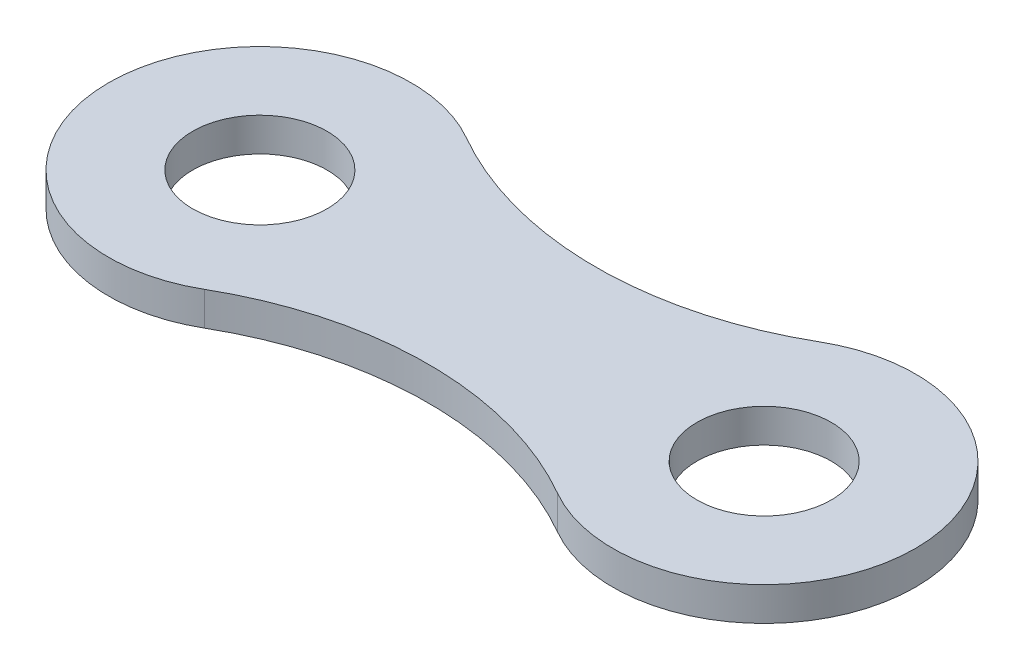
ISO-10303-21;
HEADER;
FILE_DESCRIPTION(('STEP AP214'),'2;1');
FILE_NAME('part.step','',(''),(''),'','','');
FILE_SCHEMA(('AUTOMOTIVE_DESIGN { 1 0 10303 214 1 1 1 1 }'));
ENDSEC;
DATA;
#1=APPLICATION_CONTEXT('core data for automotive mechanical design processes');
#2=APPLICATION_PROTOCOL_DEFINITION('international standard','automotive_design',2000,#1);
#3=PRODUCT_CONTEXT('',#1,'mechanical');
#4=PRODUCT('Part','Part','',(#3));
#5=PRODUCT_RELATED_PRODUCT_CATEGORY('part','',(#4));
#6=PRODUCT_DEFINITION_FORMATION('','',#4);
#7=PRODUCT_DEFINITION_CONTEXT('part definition',#1,'design');
#8=PRODUCT_DEFINITION('design','',#6,#7);
#9=PRODUCT_DEFINITION_SHAPE('','',#8);
#10=(LENGTH_UNIT() NAMED_UNIT(*) SI_UNIT(.MILLI.,.METRE.));
#11=(NAMED_UNIT(*) PLANE_ANGLE_UNIT() SI_UNIT($,.RADIAN.));
#12=(NAMED_UNIT(*) SI_UNIT($,.STERADIAN.) SOLID_ANGLE_UNIT());
#13=UNCERTAINTY_MEASURE_WITH_UNIT(LENGTH_MEASURE(1.E-05),#10,'distance_accuracy_value','');
#14=(GEOMETRIC_REPRESENTATION_CONTEXT(3) GLOBAL_UNCERTAINTY_ASSIGNED_CONTEXT((#13)) GLOBAL_UNIT_ASSIGNED_CONTEXT((#10,
#11,#12)) REPRESENTATION_CONTEXT('',''));
#15=CARTESIAN_POINT('',(0.,0.,0.));
#16=DIRECTION('',(0.,0.,1.));
#17=DIRECTION('',(1.,0.,0.));
#18=AXIS2_PLACEMENT_3D('',#15,#16,#17);
#19=CARTESIAN_POINT('',(-7.5,-1.,0.));
#20=DIRECTION('',(0.,1.,0.));
#21=DIRECTION('',(0.,0.,1.));
#22=AXIS2_PLACEMENT_3D('',#19,#20,#21);
#23=CYLINDRICAL_SURFACE('',#22,4.5);
#24=CARTESIAN_POINT('',(-7.5,0.,0.));
#25=DIRECTION('',(0.,1.,0.));
#26=DIRECTION('',(0.,0.,1.));
#27=AXIS2_PLACEMENT_3D('',#24,#25,#26);
#28=CIRCLE('',#27,4.5);
#29=CARTESIAN_POINT('',(-5.25445833901267,0.,-3.89968494224473));
#30=VERTEX_POINT('',#29);
#31=CARTESIAN_POINT('',(-5.25445833901267,0.,3.89968494224473));
#32=VERTEX_POINT('',#31);
#33=EDGE_CURVE('E104',#30,#32,#28,.T.);
#34=ORIENTED_EDGE('',*,*,#33,.F.);
#35=DIRECTION('',(0.,1.,0.));
#36=VECTOR('',#35,1.);
#37=CARTESIAN_POINT('',(-5.25445833901267,-1.,-3.89968494224473));
#38=LINE('',#37,#36);
#39=CARTESIAN_POINT('',(-5.25445833901267,-1.,-3.89968494224473));
#40=VERTEX_POINT('',#39);
#41=EDGE_CURVE('E11',#40,#30,#38,.T.);
#42=ORIENTED_EDGE('',*,*,#41,.F.);
#43=CARTESIAN_POINT('',(-7.5,-1.,0.));
#44=DIRECTION('',(0.,1.,0.));
#45=DIRECTION('',(0.,0.,1.));
#46=AXIS2_PLACEMENT_3D('',#43,#44,#45);
#47=CIRCLE('',#46,4.5);
#48=CARTESIAN_POINT('',(-5.25445833901267,-1.,3.89968494224473));
#49=VERTEX_POINT('',#48);
#50=EDGE_CURVE('E97',#40,#49,#47,.T.);
#51=ORIENTED_EDGE('',*,*,#50,.T.);
#52=DIRECTION('',(0.,1.,0.));
#53=VECTOR('',#52,1.);
#54=CARTESIAN_POINT('',(-5.25445833901267,-1.,3.89968494224473));
#55=LINE('',#54,#53);
#56=EDGE_CURVE('E42',#49,#32,#55,.T.);
#57=ORIENTED_EDGE('',*,*,#56,.T.);
#58=EDGE_LOOP('',(#34,#42,#51,#57));
#59=FACE_BOUND('',#58,.T.);
#60=ADVANCED_FACE('F39',(#59),#23,.T.);
#61=CARTESIAN_POINT('',(0.,-1.,-13.0247581574486));
#62=DIRECTION('',(0.,1.,0.));
#63=DIRECTION('',(0.,0.,1.));
#64=AXIS2_PLACEMENT_3D('',#61,#62,#63);
#65=CYLINDRICAL_SURFACE('',#64,10.529781271197);
#66=CARTESIAN_POINT('',(0.,0.,-13.0247581574486));
#67=DIRECTION('',(0.,-1.,0.));
#68=DIRECTION('',(0.,0.,1.));
#69=AXIS2_PLACEMENT_3D('',#66,#67,#68);
#70=CIRCLE('',#69,10.529781271197);
#71=CARTESIAN_POINT('',(5.25445833901267,0.,-3.89968494224473));
#72=VERTEX_POINT('',#71);
#73=EDGE_CURVE('E99',#72,#30,#70,.T.);
#74=ORIENTED_EDGE('',*,*,#73,.F.);
#75=DIRECTION('',(0.,1.,0.));
#76=VECTOR('',#75,1.);
#77=CARTESIAN_POINT('',(5.25445833901267,-1.,-3.89968494224473));
#78=LINE('',#77,#76);
#79=CARTESIAN_POINT('',(5.25445833901267,-1.,-3.89968494224473));
#80=VERTEX_POINT('',#79);
#81=EDGE_CURVE('E48',#80,#72,#78,.T.);
#82=ORIENTED_EDGE('',*,*,#81,.F.);
#83=CARTESIAN_POINT('',(0.,-1.,-13.0247581574486));
#84=DIRECTION('',(0.,-1.,0.));
#85=DIRECTION('',(0.,0.,1.));
#86=AXIS2_PLACEMENT_3D('',#83,#84,#85);
#87=CIRCLE('',#86,10.529781271197);
#88=EDGE_CURVE('E94',#80,#40,#87,.T.);
#89=ORIENTED_EDGE('',*,*,#88,.T.);
#90=ORIENTED_EDGE('',*,*,#41,.T.);
#91=EDGE_LOOP('',(#74,#82,#89,#90));
#92=FACE_BOUND('',#91,.T.);
#93=ADVANCED_FACE('F115',(#92),#65,.F.);
#94=CARTESIAN_POINT('',(7.5,-1.,0.));
#95=DIRECTION('',(0.,1.,0.));
#96=DIRECTION('',(0.,0.,1.));
#97=AXIS2_PLACEMENT_3D('',#94,#95,#96);
#98=CYLINDRICAL_SURFACE('',#97,4.5);
#99=CARTESIAN_POINT('',(7.5,0.,0.));
#100=DIRECTION('',(0.,1.,0.));
#101=DIRECTION('',(0.,0.,-1.));
#102=AXIS2_PLACEMENT_3D('',#99,#100,#101);
#103=CIRCLE('',#102,4.5);
#104=CARTESIAN_POINT('',(5.25445833901267,0.,3.89968494224473));
#105=VERTEX_POINT('',#104);
#106=EDGE_CURVE('E89',#105,#72,#103,.T.);
#107=ORIENTED_EDGE('',*,*,#106,.F.);
#108=DIRECTION('',(0.,1.,0.));
#109=VECTOR('',#108,1.);
#110=CARTESIAN_POINT('',(5.25445833901267,-1.,3.89968494224473));
#111=LINE('',#110,#109);
#112=CARTESIAN_POINT('',(5.25445833901267,-1.,3.89968494224473));
#113=VERTEX_POINT('',#112);
#114=EDGE_CURVE('E84',#113,#105,#111,.T.);
#115=ORIENTED_EDGE('',*,*,#114,.F.);
#116=CARTESIAN_POINT('',(7.5,-1.,0.));
#117=DIRECTION('',(0.,1.,0.));
#118=DIRECTION('',(0.,0.,-1.));
#119=AXIS2_PLACEMENT_3D('',#116,#117,#118);
#120=CIRCLE('',#119,4.5);
#121=EDGE_CURVE('E87',#113,#80,#120,.T.);
#122=ORIENTED_EDGE('',*,*,#121,.T.);
#123=ORIENTED_EDGE('',*,*,#81,.T.);
#124=EDGE_LOOP('',(#107,#115,#122,#123));
#125=FACE_BOUND('',#124,.T.);
#126=ADVANCED_FACE('F86',(#125),#98,.T.);
#127=CARTESIAN_POINT('',(0.,-1.,13.0247581574486));
#128=DIRECTION('',(0.,1.,0.));
#129=DIRECTION('',(0.,0.,1.));
#130=AXIS2_PLACEMENT_3D('',#127,#128,#129);
#131=CYLINDRICAL_SURFACE('',#130,10.529781271197);
#132=CARTESIAN_POINT('',(0.,0.,13.0247581574486));
#133=DIRECTION('',(0.,-1.,0.));
#134=DIRECTION('',(0.,0.,-1.));
#135=AXIS2_PLACEMENT_3D('',#132,#133,#134);
#136=CIRCLE('',#135,10.529781271197);
#137=EDGE_CURVE('E107',#32,#105,#136,.T.);
#138=ORIENTED_EDGE('',*,*,#137,.F.);
#139=ORIENTED_EDGE('',*,*,#56,.F.);
#140=CARTESIAN_POINT('',(0.,-1.,13.0247581574486));
#141=DIRECTION('',(0.,-1.,0.));
#142=DIRECTION('',(0.,0.,-1.));
#143=AXIS2_PLACEMENT_3D('',#140,#141,#142);
#144=CIRCLE('',#143,10.529781271197);
#145=EDGE_CURVE('E93',#49,#113,#144,.T.);
#146=ORIENTED_EDGE('',*,*,#145,.T.);
#147=ORIENTED_EDGE('',*,*,#114,.T.);
#148=EDGE_LOOP('',(#138,#139,#146,#147));
#149=FACE_BOUND('',#148,.T.);
#150=ADVANCED_FACE('F96',(#149),#131,.F.);
#151=CARTESIAN_POINT('',(-3.75,-1.,6.51237907872431));
#152=DIRECTION('',(0.,1.,0.));
#153=DIRECTION('',(0.,0.,1.));
#154=AXIS2_PLACEMENT_3D('',#151,#152,#153);
#155=PLANE('',#154);
#156=CARTESIAN_POINT('',(7.5,-1.,0.));
#157=DIRECTION('',(0.,1.,0.));
#158=DIRECTION('',(0.,0.,1.));
#159=AXIS2_PLACEMENT_3D('',#156,#157,#158);
#160=CIRCLE('',#159,2.);
#161=CARTESIAN_POINT('',(7.5,-1.,2.));
#162=VERTEX_POINT('',#161);
#163=EDGE_CURVE('E148',#162,#162,#160,.T.);
#164=ORIENTED_EDGE('',*,*,#163,.T.);
#165=EDGE_LOOP('',(#164));
#166=FACE_BOUND('',#165,.T.);
#167=CARTESIAN_POINT('',(-7.5,-1.,0.));
#168=DIRECTION('',(0.,1.,0.));
#169=DIRECTION('',(0.,0.,1.));
#170=AXIS2_PLACEMENT_3D('',#167,#168,#169);
#171=CIRCLE('',#170,2.);
#172=CARTESIAN_POINT('',(-7.5,-1.,2.));
#173=VERTEX_POINT('',#172);
#174=EDGE_CURVE('E108',#173,#173,#171,.T.);
#175=ORIENTED_EDGE('',*,*,#174,.T.);
#176=EDGE_LOOP('',(#175));
#177=FACE_BOUND('',#176,.T.);
#178=ORIENTED_EDGE('',*,*,#50,.F.);
#179=ORIENTED_EDGE('',*,*,#88,.F.);
#180=ORIENTED_EDGE('',*,*,#121,.F.);
#181=ORIENTED_EDGE('',*,*,#145,.F.);
#182=EDGE_LOOP('',(#178,#179,#180,#181));
#183=FACE_BOUND('',#182,.T.);
#184=ADVANCED_FACE('F92',(#166,#177,#183),#155,.F.);
#185=CARTESIAN_POINT('',(-3.75,0.,6.51237907872431));
#186=DIRECTION('',(0.,1.,0.));
#187=DIRECTION('',(0.,0.,1.));
#188=AXIS2_PLACEMENT_3D('',#185,#186,#187);
#189=PLANE('',#188);
#190=CARTESIAN_POINT('',(7.5,0.,0.));
#191=DIRECTION('',(0.,1.,0.));
#192=DIRECTION('',(0.,0.,1.));
#193=AXIS2_PLACEMENT_3D('',#190,#191,#192);
#194=CIRCLE('',#193,2.);
#195=CARTESIAN_POINT('',(7.5,0.,2.));
#196=VERTEX_POINT('',#195);
#197=EDGE_CURVE('E151',#196,#196,#194,.T.);
#198=ORIENTED_EDGE('',*,*,#197,.F.);
#199=EDGE_LOOP('',(#198));
#200=FACE_BOUND('',#199,.T.);
#201=CARTESIAN_POINT('',(-7.5,0.,0.));
#202=DIRECTION('',(0.,1.,0.));
#203=DIRECTION('',(0.,0.,1.));
#204=AXIS2_PLACEMENT_3D('',#201,#202,#203);
#205=CIRCLE('',#204,2.);
#206=CARTESIAN_POINT('',(-7.5,0.,2.));
#207=VERTEX_POINT('',#206);
#208=EDGE_CURVE('E153',#207,#207,#205,.T.);
#209=ORIENTED_EDGE('',*,*,#208,.F.);
#210=EDGE_LOOP('',(#209));
#211=FACE_BOUND('',#210,.T.);
#212=ORIENTED_EDGE('',*,*,#33,.T.);
#213=ORIENTED_EDGE('',*,*,#137,.T.);
#214=ORIENTED_EDGE('',*,*,#106,.T.);
#215=ORIENTED_EDGE('',*,*,#73,.T.);
#216=EDGE_LOOP('',(#212,#213,#214,#215));
#217=FACE_BOUND('',#216,.T.);
#218=ADVANCED_FACE('F114',(#200,#211,#217),#189,.T.);
#219=CARTESIAN_POINT('',(-7.5,-1.,0.));
#220=DIRECTION('',(0.,1.,0.));
#221=DIRECTION('',(0.,0.,1.));
#222=AXIS2_PLACEMENT_3D('',#219,#220,#221);
#223=CYLINDRICAL_SURFACE('',#222,2.);
#224=ORIENTED_EDGE('',*,*,#174,.F.);
#225=EDGE_LOOP('',(#224));
#226=FACE_BOUND('',#225,.T.);
#227=ORIENTED_EDGE('',*,*,#208,.T.);
#228=EDGE_LOOP('',(#227));
#229=FACE_BOUND('',#228,.T.);
#230=ADVANCED_FACE('F133',(#226,#229),#223,.F.);
#231=CARTESIAN_POINT('',(7.5,-1.,0.));
#232=DIRECTION('',(0.,1.,0.));
#233=DIRECTION('',(0.,0.,1.));
#234=AXIS2_PLACEMENT_3D('',#231,#232,#233);
#235=CYLINDRICAL_SURFACE('',#234,2.);
#236=ORIENTED_EDGE('',*,*,#163,.F.);
#237=EDGE_LOOP('',(#236));
#238=FACE_BOUND('',#237,.T.);
#239=ORIENTED_EDGE('',*,*,#197,.T.);
#240=EDGE_LOOP('',(#239));
#241=FACE_BOUND('',#240,.T.);
#242=ADVANCED_FACE('F140',(#238,#241),#235,.F.);
#243=CLOSED_SHELL('',(#60,#93,#126,#150,#184,#218,#230,#242));
#244=MANIFOLD_SOLID_BREP('B2',#243);
#245=ADVANCED_BREP_SHAPE_REPRESENTATION('',(#18,#244),#14);
#246=SHAPE_DEFINITION_REPRESENTATION(#9,#245);
ENDSEC;
END-ISO-10303-21;
